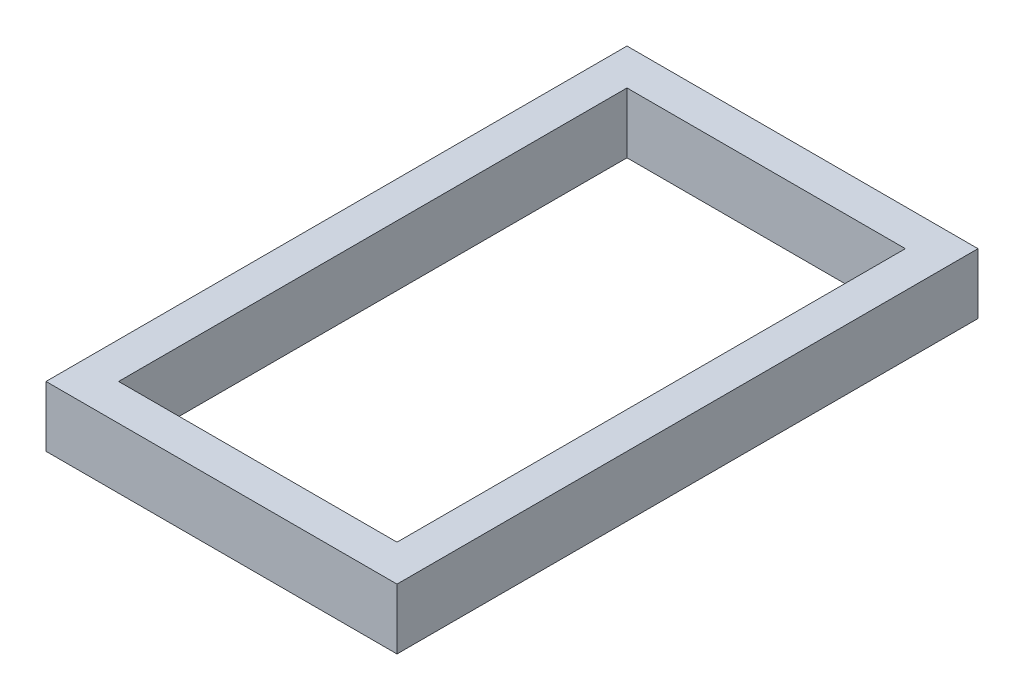
ISO-10303-21;
HEADER;
FILE_DESCRIPTION(('STEP AP214'),'2;1');
FILE_NAME('part.step','',(''),(''),'','','');
FILE_SCHEMA(('AUTOMOTIVE_DESIGN { 1 0 10303 214 1 1 1 1 }'));
ENDSEC;
DATA;
#1=APPLICATION_CONTEXT('core data for automotive mechanical design processes');
#2=APPLICATION_PROTOCOL_DEFINITION('international standard','automotive_design',2000,#1);
#3=PRODUCT_CONTEXT('',#1,'mechanical');
#4=PRODUCT('Part','Part','',(#3));
#5=PRODUCT_RELATED_PRODUCT_CATEGORY('part','',(#4));
#6=PRODUCT_DEFINITION_FORMATION('','',#4);
#7=PRODUCT_DEFINITION_CONTEXT('part definition',#1,'design');
#8=PRODUCT_DEFINITION('design','',#6,#7);
#9=PRODUCT_DEFINITION_SHAPE('','',#8);
#10=(LENGTH_UNIT() NAMED_UNIT(*) SI_UNIT(.MILLI.,.METRE.));
#11=(NAMED_UNIT(*) PLANE_ANGLE_UNIT() SI_UNIT($,.RADIAN.));
#12=(NAMED_UNIT(*) SI_UNIT($,.STERADIAN.) SOLID_ANGLE_UNIT());
#13=UNCERTAINTY_MEASURE_WITH_UNIT(LENGTH_MEASURE(1.E-05),#10,'distance_accuracy_value','');
#14=(GEOMETRIC_REPRESENTATION_CONTEXT(3) GLOBAL_UNCERTAINTY_ASSIGNED_CONTEXT((#13)) GLOBAL_UNIT_ASSIGNED_CONTEXT((#10,
#11,#12)) REPRESENTATION_CONTEXT('',''));
#15=CARTESIAN_POINT('',(0.,0.,0.));
#16=DIRECTION('',(0.,0.,1.));
#17=DIRECTION('',(1.,0.,0.));
#18=AXIS2_PLACEMENT_3D('',#15,#16,#17);
#19=CARTESIAN_POINT('',(0.,5.,0.));
#20=DIRECTION('',(0.,1.,0.));
#21=DIRECTION('',(0.,0.,1.));
#22=AXIS2_PLACEMENT_3D('',#19,#20,#21);
#23=PLANE('',#22);
#24=DIRECTION('',(1.,0.,0.));
#25=VECTOR('',#24,1.);
#26=CARTESIAN_POINT('',(-14.5,5.,24.));
#27=LINE('',#26,#25);
#28=CARTESIAN_POINT('',(-14.5,5.,24.));
#29=VERTEX_POINT('',#28);
#30=CARTESIAN_POINT('',(14.5,5.,24.));
#31=VERTEX_POINT('',#30);
#32=EDGE_CURVE('E159',#29,#31,#27,.T.);
#33=ORIENTED_EDGE('',*,*,#32,.T.);
#34=DIRECTION('',(0.,0.,-1.));
#35=VECTOR('',#34,1.);
#36=CARTESIAN_POINT('',(14.5,5.,24.));
#37=LINE('',#36,#35);
#38=CARTESIAN_POINT('',(14.5,5.,-24.));
#39=VERTEX_POINT('',#38);
#40=EDGE_CURVE('E163',#31,#39,#37,.T.);
#41=ORIENTED_EDGE('',*,*,#40,.T.);
#42=DIRECTION('',(-1.,0.,0.));
#43=VECTOR('',#42,1.);
#44=CARTESIAN_POINT('',(-14.5,5.,-24.));
#45=LINE('',#44,#43);
#46=CARTESIAN_POINT('',(-14.5,5.,-24.));
#47=VERTEX_POINT('',#46);
#48=EDGE_CURVE('E167',#39,#47,#45,.T.);
#49=ORIENTED_EDGE('',*,*,#48,.T.);
#50=DIRECTION('',(0.,0.,1.));
#51=VECTOR('',#50,1.);
#52=CARTESIAN_POINT('',(-14.5,5.,24.));
#53=LINE('',#52,#51);
#54=EDGE_CURVE('E170',#47,#29,#53,.T.);
#55=ORIENTED_EDGE('',*,*,#54,.T.);
#56=EDGE_LOOP('',(#33,#41,#49,#55));
#57=FACE_BOUND('',#56,.T.);
#58=DIRECTION('',(-1.,0.,0.));
#59=VECTOR('',#58,1.);
#60=CARTESIAN_POINT('',(-11.5,5.,-21.));
#61=LINE('',#60,#59);
#62=CARTESIAN_POINT('',(11.5,5.,-21.));
#63=VERTEX_POINT('',#62);
#64=CARTESIAN_POINT('',(-11.5,5.,-21.));
#65=VERTEX_POINT('',#64);
#66=EDGE_CURVE('E120',#63,#65,#61,.T.);
#67=ORIENTED_EDGE('',*,*,#66,.F.);
#68=DIRECTION('',(0.,0.,-1.));
#69=VECTOR('',#68,1.);
#70=CARTESIAN_POINT('',(11.5,5.,21.));
#71=LINE('',#70,#69);
#72=CARTESIAN_POINT('',(11.5,5.,21.));
#73=VERTEX_POINT('',#72);
#74=EDGE_CURVE('E111',#73,#63,#71,.T.);
#75=ORIENTED_EDGE('',*,*,#74,.F.);
#76=DIRECTION('',(1.,0.,0.));
#77=VECTOR('',#76,1.);
#78=CARTESIAN_POINT('',(-11.5,5.,21.));
#79=LINE('',#78,#77);
#80=CARTESIAN_POINT('',(-11.5,5.,21.));
#81=VERTEX_POINT('',#80);
#82=EDGE_CURVE('E137',#81,#73,#79,.T.);
#83=ORIENTED_EDGE('',*,*,#82,.F.);
#84=DIRECTION('',(0.,0.,1.));
#85=VECTOR('',#84,1.);
#86=CARTESIAN_POINT('',(-11.5,5.,21.));
#87=LINE('',#86,#85);
#88=EDGE_CURVE('E133',#65,#81,#87,.T.);
#89=ORIENTED_EDGE('',*,*,#88,.F.);
#90=EDGE_LOOP('',(#67,#75,#83,#89));
#91=FACE_BOUND('',#90,.T.);
#92=ADVANCED_FACE('F45',(#57,#91),#23,.T.);
#93=CARTESIAN_POINT('',(0.,0.,0.));
#94=DIRECTION('',(0.,1.,0.));
#95=DIRECTION('',(0.,0.,1.));
#96=AXIS2_PLACEMENT_3D('',#93,#94,#95);
#97=PLANE('',#96);
#98=DIRECTION('',(1.,0.,0.));
#99=VECTOR('',#98,1.);
#100=CARTESIAN_POINT('',(-14.5,0.,24.));
#101=LINE('',#100,#99);
#102=CARTESIAN_POINT('',(-14.5,0.,24.));
#103=VERTEX_POINT('',#102);
#104=CARTESIAN_POINT('',(14.5,0.,24.));
#105=VERTEX_POINT('',#104);
#106=EDGE_CURVE('E129',#103,#105,#101,.T.);
#107=ORIENTED_EDGE('',*,*,#106,.F.);
#108=DIRECTION('',(0.,0.,1.));
#109=VECTOR('',#108,1.);
#110=CARTESIAN_POINT('',(-14.5,0.,24.));
#111=LINE('',#110,#109);
#112=CARTESIAN_POINT('',(-14.5,0.,-24.));
#113=VERTEX_POINT('',#112);
#114=EDGE_CURVE('E164',#113,#103,#111,.T.);
#115=ORIENTED_EDGE('',*,*,#114,.F.);
#116=DIRECTION('',(-1.,0.,0.));
#117=VECTOR('',#116,1.);
#118=CARTESIAN_POINT('',(-14.5,0.,-24.));
#119=LINE('',#118,#117);
#120=CARTESIAN_POINT('',(14.5,0.,-24.));
#121=VERTEX_POINT('',#120);
#122=EDGE_CURVE('E180',#121,#113,#119,.T.);
#123=ORIENTED_EDGE('',*,*,#122,.F.);
#124=DIRECTION('',(0.,0.,-1.));
#125=VECTOR('',#124,1.);
#126=CARTESIAN_POINT('',(14.5,0.,24.));
#127=LINE('',#126,#125);
#128=EDGE_CURVE('E177',#105,#121,#127,.T.);
#129=ORIENTED_EDGE('',*,*,#128,.F.);
#130=EDGE_LOOP('',(#107,#115,#123,#129));
#131=FACE_BOUND('',#130,.T.);
#132=DIRECTION('',(0.,0.,-1.));
#133=VECTOR('',#132,1.);
#134=CARTESIAN_POINT('',(11.5,0.,21.));
#135=LINE('',#134,#133);
#136=CARTESIAN_POINT('',(11.5,0.,21.));
#137=VERTEX_POINT('',#136);
#138=CARTESIAN_POINT('',(11.5,0.,-21.));
#139=VERTEX_POINT('',#138);
#140=EDGE_CURVE('E69',#137,#139,#135,.T.);
#141=ORIENTED_EDGE('',*,*,#140,.T.);
#142=DIRECTION('',(-1.,0.,0.));
#143=VECTOR('',#142,1.);
#144=CARTESIAN_POINT('',(-11.5,0.,-21.));
#145=LINE('',#144,#143);
#146=CARTESIAN_POINT('',(-11.5,0.,-21.));
#147=VERTEX_POINT('',#146);
#148=EDGE_CURVE('E127',#139,#147,#145,.T.);
#149=ORIENTED_EDGE('',*,*,#148,.T.);
#150=DIRECTION('',(0.,0.,1.));
#151=VECTOR('',#150,1.);
#152=CARTESIAN_POINT('',(-11.5,0.,21.));
#153=LINE('',#152,#151);
#154=CARTESIAN_POINT('',(-11.5,0.,21.));
#155=VERTEX_POINT('',#154);
#156=EDGE_CURVE('E146',#147,#155,#153,.T.);
#157=ORIENTED_EDGE('',*,*,#156,.T.);
#158=DIRECTION('',(1.,0.,0.));
#159=VECTOR('',#158,1.);
#160=CARTESIAN_POINT('',(-11.5,0.,21.));
#161=LINE('',#160,#159);
#162=EDGE_CURVE('E121',#155,#137,#161,.T.);
#163=ORIENTED_EDGE('',*,*,#162,.T.);
#164=EDGE_LOOP('',(#141,#149,#157,#163));
#165=FACE_BOUND('',#164,.T.);
#166=ADVANCED_FACE('F203',(#131,#165),#97,.F.);
#167=CARTESIAN_POINT('',(-14.5,5.,24.));
#168=DIRECTION('',(0.,0.,-1.));
#169=DIRECTION('',(-1.,0.,0.));
#170=AXIS2_PLACEMENT_3D('',#167,#168,#169);
#171=PLANE('',#170);
#172=ORIENTED_EDGE('',*,*,#106,.T.);
#173=DIRECTION('',(0.,-1.,0.));
#174=VECTOR('',#173,1.);
#175=CARTESIAN_POINT('',(14.5,5.,24.));
#176=LINE('',#175,#174);
#177=EDGE_CURVE('E11',#31,#105,#176,.T.);
#178=ORIENTED_EDGE('',*,*,#177,.F.);
#179=ORIENTED_EDGE('',*,*,#32,.F.);
#180=DIRECTION('',(0.,-1.,0.));
#181=VECTOR('',#180,1.);
#182=CARTESIAN_POINT('',(-14.5,5.,24.));
#183=LINE('',#182,#181);
#184=EDGE_CURVE('E173',#29,#103,#183,.T.);
#185=ORIENTED_EDGE('',*,*,#184,.T.);
#186=EDGE_LOOP('',(#172,#178,#179,#185));
#187=FACE_BOUND('',#186,.T.);
#188=ADVANCED_FACE('F47',(#187),#171,.F.);
#189=CARTESIAN_POINT('',(14.5,5.,24.));
#190=DIRECTION('',(-1.,0.,0.));
#191=DIRECTION('',(0.,0.,1.));
#192=AXIS2_PLACEMENT_3D('',#189,#190,#191);
#193=PLANE('',#192);
#194=ORIENTED_EDGE('',*,*,#128,.T.);
#195=DIRECTION('',(0.,-1.,0.));
#196=VECTOR('',#195,1.);
#197=CARTESIAN_POINT('',(14.5,5.,-24.));
#198=LINE('',#197,#196);
#199=EDGE_CURVE('E54',#39,#121,#198,.T.);
#200=ORIENTED_EDGE('',*,*,#199,.F.);
#201=ORIENTED_EDGE('',*,*,#40,.F.);
#202=ORIENTED_EDGE('',*,*,#177,.T.);
#203=EDGE_LOOP('',(#194,#200,#201,#202));
#204=FACE_BOUND('',#203,.T.);
#205=ADVANCED_FACE('F213',(#204),#193,.F.);
#206=CARTESIAN_POINT('',(-14.5,5.,-24.));
#207=DIRECTION('',(0.,0.,1.));
#208=DIRECTION('',(1.,0.,0.));
#209=AXIS2_PLACEMENT_3D('',#206,#207,#208);
#210=PLANE('',#209);
#211=ORIENTED_EDGE('',*,*,#122,.T.);
#212=DIRECTION('',(0.,-1.,0.));
#213=VECTOR('',#212,1.);
#214=CARTESIAN_POINT('',(-14.5,5.,-24.));
#215=LINE('',#214,#213);
#216=EDGE_CURVE('E188',#47,#113,#215,.T.);
#217=ORIENTED_EDGE('',*,*,#216,.F.);
#218=ORIENTED_EDGE('',*,*,#48,.F.);
#219=ORIENTED_EDGE('',*,*,#199,.T.);
#220=EDGE_LOOP('',(#211,#217,#218,#219));
#221=FACE_BOUND('',#220,.T.);
#222=ADVANCED_FACE('F197',(#221),#210,.F.);
#223=CARTESIAN_POINT('',(-14.5,5.,24.));
#224=DIRECTION('',(1.,0.,0.));
#225=DIRECTION('',(0.,0.,-1.));
#226=AXIS2_PLACEMENT_3D('',#223,#224,#225);
#227=PLANE('',#226);
#228=ORIENTED_EDGE('',*,*,#114,.T.);
#229=ORIENTED_EDGE('',*,*,#184,.F.);
#230=ORIENTED_EDGE('',*,*,#54,.F.);
#231=ORIENTED_EDGE('',*,*,#216,.T.);
#232=EDGE_LOOP('',(#228,#229,#230,#231));
#233=FACE_BOUND('',#232,.T.);
#234=ADVANCED_FACE('F207',(#233),#227,.F.);
#235=CARTESIAN_POINT('',(11.5,5.,21.));
#236=DIRECTION('',(-1.,0.,0.));
#237=DIRECTION('',(0.,0.,1.));
#238=AXIS2_PLACEMENT_3D('',#235,#236,#237);
#239=PLANE('',#238);
#240=ORIENTED_EDGE('',*,*,#140,.F.);
#241=DIRECTION('',(0.,-1.,0.));
#242=VECTOR('',#241,1.);
#243=CARTESIAN_POINT('',(11.5,5.,21.));
#244=LINE('',#243,#242);
#245=EDGE_CURVE('E115',#73,#137,#244,.T.);
#246=ORIENTED_EDGE('',*,*,#245,.F.);
#247=ORIENTED_EDGE('',*,*,#74,.T.);
#248=DIRECTION('',(0.,-1.,0.));
#249=VECTOR('',#248,1.);
#250=CARTESIAN_POINT('',(11.5,5.,-21.));
#251=LINE('',#250,#249);
#252=EDGE_CURVE('E114',#63,#139,#251,.T.);
#253=ORIENTED_EDGE('',*,*,#252,.T.);
#254=EDGE_LOOP('',(#240,#246,#247,#253));
#255=FACE_BOUND('',#254,.T.);
#256=ADVANCED_FACE('F113',(#255),#239,.T.);
#257=CARTESIAN_POINT('',(-11.5,5.,-21.));
#258=DIRECTION('',(0.,0.,1.));
#259=DIRECTION('',(1.,0.,0.));
#260=AXIS2_PLACEMENT_3D('',#257,#258,#259);
#261=PLANE('',#260);
#262=ORIENTED_EDGE('',*,*,#148,.F.);
#263=ORIENTED_EDGE('',*,*,#252,.F.);
#264=ORIENTED_EDGE('',*,*,#66,.T.);
#265=DIRECTION('',(0.,-1.,0.));
#266=VECTOR('',#265,1.);
#267=CARTESIAN_POINT('',(-11.5,5.,-21.));
#268=LINE('',#267,#266);
#269=EDGE_CURVE('E130',#65,#147,#268,.T.);
#270=ORIENTED_EDGE('',*,*,#269,.T.);
#271=EDGE_LOOP('',(#262,#263,#264,#270));
#272=FACE_BOUND('',#271,.T.);
#273=ADVANCED_FACE('F124',(#272),#261,.T.);
#274=CARTESIAN_POINT('',(-11.5,5.,21.));
#275=DIRECTION('',(1.,0.,0.));
#276=DIRECTION('',(0.,0.,-1.));
#277=AXIS2_PLACEMENT_3D('',#274,#275,#276);
#278=PLANE('',#277);
#279=ORIENTED_EDGE('',*,*,#156,.F.);
#280=ORIENTED_EDGE('',*,*,#269,.F.);
#281=ORIENTED_EDGE('',*,*,#88,.T.);
#282=DIRECTION('',(0.,-1.,0.));
#283=VECTOR('',#282,1.);
#284=CARTESIAN_POINT('',(-11.5,5.,21.));
#285=LINE('',#284,#283);
#286=EDGE_CURVE('E61',#81,#155,#285,.T.);
#287=ORIENTED_EDGE('',*,*,#286,.T.);
#288=EDGE_LOOP('',(#279,#280,#281,#287));
#289=FACE_BOUND('',#288,.T.);
#290=ADVANCED_FACE('F236',(#289),#278,.T.);
#291=CARTESIAN_POINT('',(-11.5,5.,21.));
#292=DIRECTION('',(0.,0.,-1.));
#293=DIRECTION('',(-1.,0.,0.));
#294=AXIS2_PLACEMENT_3D('',#291,#292,#293);
#295=PLANE('',#294);
#296=ORIENTED_EDGE('',*,*,#162,.F.);
#297=ORIENTED_EDGE('',*,*,#286,.F.);
#298=ORIENTED_EDGE('',*,*,#82,.T.);
#299=ORIENTED_EDGE('',*,*,#245,.T.);
#300=EDGE_LOOP('',(#296,#297,#298,#299));
#301=FACE_BOUND('',#300,.T.);
#302=ADVANCED_FACE('F240',(#301),#295,.T.);
#303=CLOSED_SHELL('',(#92,#166,#188,#205,#222,#234,#256,#273,#290,#302));
#304=MANIFOLD_SOLID_BREP('B2',#303);
#305=ADVANCED_BREP_SHAPE_REPRESENTATION('',(#18,#304),#14);
#306=SHAPE_DEFINITION_REPRESENTATION(#9,#305);
ENDSEC;
END-ISO-10303-21;
